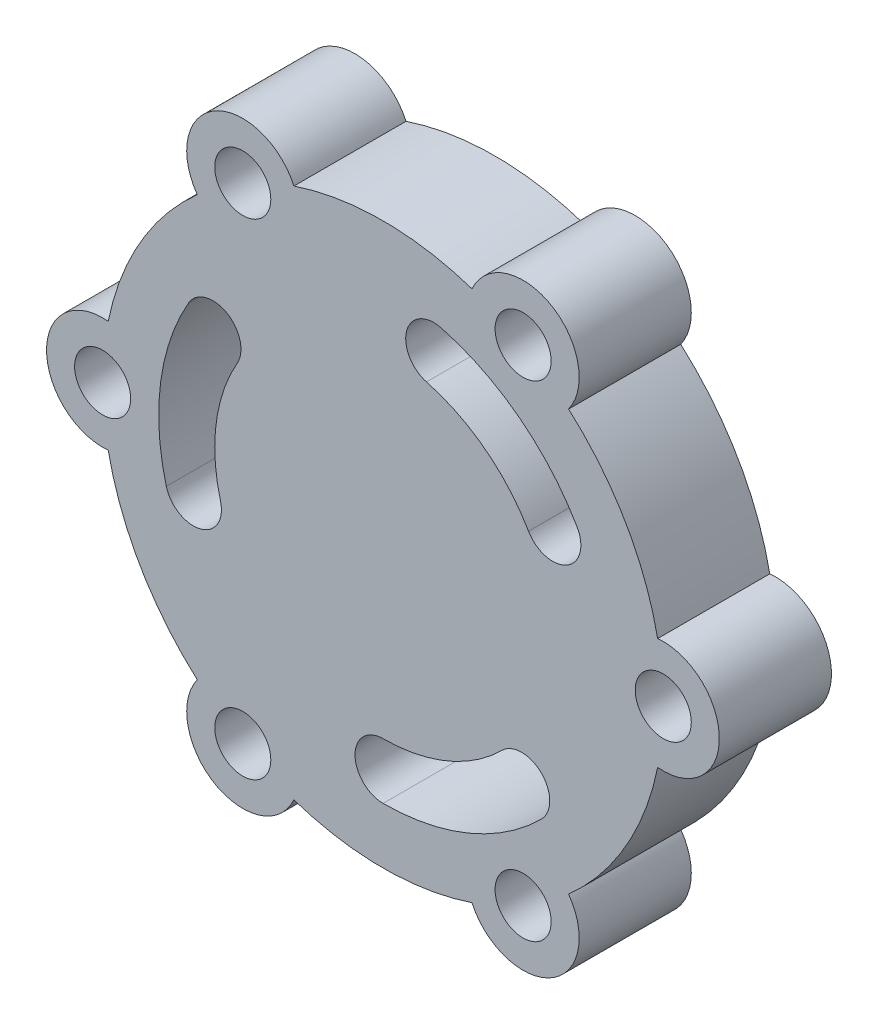
ISO-10303-21;
HEADER;
FILE_DESCRIPTION(('STEP AP214'),'2;1');
FILE_NAME('part.step','',(''),(''),'','','');
FILE_SCHEMA(('AUTOMOTIVE_DESIGN { 1 0 10303 214 1 1 1 1 }'));
ENDSEC;
DATA;
#1=APPLICATION_CONTEXT('core data for automotive mechanical design processes');
#2=APPLICATION_PROTOCOL_DEFINITION('international standard','automotive_design',2000,#1);
#3=PRODUCT_CONTEXT('',#1,'mechanical');
#4=PRODUCT('Part','Part','',(#3));
#5=PRODUCT_RELATED_PRODUCT_CATEGORY('part','',(#4));
#6=PRODUCT_DEFINITION_FORMATION('','',#4);
#7=PRODUCT_DEFINITION_CONTEXT('part definition',#1,'design');
#8=PRODUCT_DEFINITION('design','',#6,#7);
#9=PRODUCT_DEFINITION_SHAPE('','',#8);
#10=(LENGTH_UNIT() NAMED_UNIT(*) SI_UNIT(.MILLI.,.METRE.));
#11=(NAMED_UNIT(*) PLANE_ANGLE_UNIT() SI_UNIT($,.RADIAN.));
#12=(NAMED_UNIT(*) SI_UNIT($,.STERADIAN.) SOLID_ANGLE_UNIT());
#13=UNCERTAINTY_MEASURE_WITH_UNIT(LENGTH_MEASURE(1.E-05),#10,'distance_accuracy_value','');
#14=(GEOMETRIC_REPRESENTATION_CONTEXT(3) GLOBAL_UNCERTAINTY_ASSIGNED_CONTEXT((#13)) GLOBAL_UNIT_ASSIGNED_CONTEXT((#10,
#11,#12)) REPRESENTATION_CONTEXT('',''));
#15=CARTESIAN_POINT('',(0.,0.,0.));
#16=DIRECTION('',(0.,0.,1.));
#17=DIRECTION('',(1.,0.,0.));
#18=AXIS2_PLACEMENT_3D('',#15,#16,#17);
#19=CARTESIAN_POINT('',(45.000000000004,70.0000000000002,20.));
#20=DIRECTION('',(0.,0.,1.));
#21=DIRECTION('',(1.,0.,0.));
#22=AXIS2_PLACEMENT_3D('',#19,#20,#21);
#23=PLANE('',#22);
#24=CARTESIAN_POINT('',(45.0000000000064,113.301270189219,20.));
#25=DIRECTION('',(0.,0.,1.));
#26=DIRECTION('',(1.,0.,0.));
#27=AXIS2_PLACEMENT_3D('',#24,#25,#26);
#28=CIRCLE('',#27,4.99999999999999);
#29=CARTESIAN_POINT('',(50.0000000000064,113.301270189219,20.));
#30=VERTEX_POINT('',#29);
#31=EDGE_CURVE('E305',#30,#30,#28,.T.);
#32=ORIENTED_EDGE('',*,*,#31,.F.);
#33=EDGE_LOOP('',(#32));
#34=FACE_BOUND('',#33,.T.);
#35=CARTESIAN_POINT('',(45.0000000000058,26.6987298107816,20.));
#36=DIRECTION('',(0.,0.,1.));
#37=DIRECTION('',(1.,0.,0.));
#38=AXIS2_PLACEMENT_3D('',#35,#36,#37);
#39=CIRCLE('',#38,5.);
#40=CARTESIAN_POINT('',(50.0000000000058,26.6987298107816,20.));
#41=VERTEX_POINT('',#40);
#42=EDGE_CURVE('E316',#41,#41,#39,.T.);
#43=ORIENTED_EDGE('',*,*,#42,.F.);
#44=EDGE_LOOP('',(#43));
#45=FACE_BOUND('',#44,.T.);
#46=CARTESIAN_POINT('',(120.,70.,20.));
#47=DIRECTION('',(0.,0.,1.));
#48=DIRECTION('',(1.,0.,0.));
#49=AXIS2_PLACEMENT_3D('',#46,#47,#48);
#50=CIRCLE('',#49,5.00000000000001);
#51=CARTESIAN_POINT('',(125.,70.,20.));
#52=VERTEX_POINT('',#51);
#53=EDGE_CURVE('E329',#52,#52,#50,.T.);
#54=ORIENTED_EDGE('',*,*,#53,.F.);
#55=EDGE_LOOP('',(#54));
#56=FACE_BOUND('',#55,.T.);
#57=CARTESIAN_POINT('',(70.,70.,20.));
#58=DIRECTION('',(0.,0.,1.));
#59=DIRECTION('',(1.,0.,0.));
#60=AXIS2_PLACEMENT_3D('',#57,#58,#59);
#61=CIRCLE('',#60,50.);
#62=CARTESIAN_POINT('',(36.8831560301955,107.460307599907,20.));
#63=VERTEX_POINT('',#62);
#64=CARTESIAN_POINT('',(21.0000000000002,79.9498743710673,20.));
#65=VERTEX_POINT('',#64);
#66=EDGE_CURVE('E333',#63,#65,#61,.T.);
#67=ORIENTED_EDGE('',*,*,#66,.T.);
#68=CARTESIAN_POINT('',(20.000000000008,70.0000000000003,20.));
#69=DIRECTION('',(0.,0.,1.));
#70=DIRECTION('',(1.,0.,0.));
#71=AXIS2_PLACEMENT_3D('',#68,#69,#70);
#72=CIRCLE('',#71,10.);
#73=CARTESIAN_POINT('',(21.0000000000001,60.0501256289334,20.));
#74=VERTEX_POINT('',#73);
#75=EDGE_CURVE('E340',#65,#74,#72,.T.);
#76=ORIENTED_EDGE('',*,*,#75,.T.);
#77=CARTESIAN_POINT('',(70.,70.,20.));
#78=DIRECTION('',(0.,0.,1.));
#79=DIRECTION('',(1.,0.,0.));
#80=AXIS2_PLACEMENT_3D('',#77,#78,#79);
#81=CIRCLE('',#80,50.);
#82=CARTESIAN_POINT('',(36.8831560301949,32.5396924000939,20.));
#83=VERTEX_POINT('',#82);
#84=EDGE_CURVE('E338',#74,#83,#81,.T.);
#85=ORIENTED_EDGE('',*,*,#84,.T.);
#86=CARTESIAN_POINT('',(45.0000000000058,26.6987298107816,20.));
#87=DIRECTION('',(0.,0.,1.));
#88=DIRECTION('',(1.,0.,0.));
#89=AXIS2_PLACEMENT_3D('',#86,#87,#88);
#90=CIRCLE('',#89,10.);
#91=CARTESIAN_POINT('',(54.1168439698107,22.5898180290282,20.));
#92=VERTEX_POINT('',#91);
#93=EDGE_CURVE('E342',#83,#92,#90,.T.);
#94=ORIENTED_EDGE('',*,*,#93,.T.);
#95=CARTESIAN_POINT('',(70.,70.,20.));
#96=DIRECTION('',(0.,0.,1.));
#97=DIRECTION('',(1.,0.,0.));
#98=AXIS2_PLACEMENT_3D('',#95,#96,#97);
#99=CIRCLE('',#98,50.);
#100=CARTESIAN_POINT('',(85.8831560301959,22.5898180290304,20.));
#101=VERTEX_POINT('',#100);
#102=EDGE_CURVE('E343',#92,#101,#99,.T.);
#103=ORIENTED_EDGE('',*,*,#102,.T.);
#104=CARTESIAN_POINT('',(95.0000000000019,26.6987298107814,20.));
#105=DIRECTION('',(0.,0.,1.));
#106=DIRECTION('',(1.,0.,0.));
#107=AXIS2_PLACEMENT_3D('',#104,#105,#106);
#108=CIRCLE('',#107,9.99999999999999);
#109=CARTESIAN_POINT('',(103.11684396981,32.5396924000979,20.));
#110=VERTEX_POINT('',#109);
#111=EDGE_CURVE('E348',#101,#110,#108,.T.);
#112=ORIENTED_EDGE('',*,*,#111,.T.);
#113=CARTESIAN_POINT('',(70.,70.,20.));
#114=DIRECTION('',(0.,0.,1.));
#115=DIRECTION('',(1.,0.,0.));
#116=AXIS2_PLACEMENT_3D('',#113,#114,#115);
#117=CIRCLE('',#116,50.);
#118=CARTESIAN_POINT('',(119.,60.0501256289338,20.));
#119=VERTEX_POINT('',#118);
#120=EDGE_CURVE('E346',#110,#119,#117,.T.);
#121=ORIENTED_EDGE('',*,*,#120,.T.);
#122=CARTESIAN_POINT('',(120.,70.,20.));
#123=DIRECTION('',(0.,0.,1.));
#124=DIRECTION('',(1.,0.,0.));
#125=AXIS2_PLACEMENT_3D('',#122,#123,#124);
#126=CIRCLE('',#125,10.);
#127=CARTESIAN_POINT('',(119.,79.9498743710662,20.));
#128=VERTEX_POINT('',#127);
#129=EDGE_CURVE('E349',#119,#128,#126,.T.);
#130=ORIENTED_EDGE('',*,*,#129,.T.);
#131=CARTESIAN_POINT('',(70.,70.,20.));
#132=DIRECTION('',(0.,0.,1.));
#133=DIRECTION('',(1.,0.,0.));
#134=AXIS2_PLACEMENT_3D('',#131,#132,#133);
#135=CIRCLE('',#134,50.);
#136=CARTESIAN_POINT('',(103.11684396981,107.460307599902,20.));
#137=VERTEX_POINT('',#136);
#138=EDGE_CURVE('E355',#128,#137,#135,.T.);
#139=ORIENTED_EDGE('',*,*,#138,.T.);
#140=CARTESIAN_POINT('',(95.0000000000025,113.301270189218,20.));
#141=DIRECTION('',(0.,0.,1.));
#142=DIRECTION('',(1.,0.,0.));
#143=AXIS2_PLACEMENT_3D('',#140,#141,#142);
#144=CIRCLE('',#143,10.);
#145=CARTESIAN_POINT('',(85.8831560301966,117.410181970969,20.));
#146=VERTEX_POINT('',#145);
#147=EDGE_CURVE('E354',#137,#146,#144,.T.);
#148=ORIENTED_EDGE('',*,*,#147,.T.);
#149=CARTESIAN_POINT('',(70.,70.,20.));
#150=DIRECTION('',(0.,0.,1.));
#151=DIRECTION('',(1.,0.,0.));
#152=AXIS2_PLACEMENT_3D('',#149,#150,#151);
#153=CIRCLE('',#152,50.);
#154=CARTESIAN_POINT('',(54.1168439698113,117.410181970972,20.));
#155=VERTEX_POINT('',#154);
#156=EDGE_CURVE('E356',#146,#155,#153,.T.);
#157=ORIENTED_EDGE('',*,*,#156,.T.);
#158=CARTESIAN_POINT('',(45.0000000000064,113.301270189219,20.));
#159=DIRECTION('',(0.,0.,1.));
#160=DIRECTION('',(1.,0.,0.));
#161=AXIS2_PLACEMENT_3D('',#158,#159,#160);
#162=CIRCLE('',#161,9.99999999999999);
#163=EDGE_CURVE('E358',#155,#63,#162,.T.);
#164=ORIENTED_EDGE('',*,*,#163,.T.);
#165=EDGE_LOOP('',(#67,#76,#85,#94,#103,#112,#121,#130,#139,#148,#157,#164));
#166=FACE_BOUND('',#165,.T.);
#167=CARTESIAN_POINT('',(95.0000000000019,26.6987298107814,20.));
#168=DIRECTION('',(0.,0.,1.));
#169=DIRECTION('',(1.,0.,0.));
#170=AXIS2_PLACEMENT_3D('',#167,#168,#169);
#171=CIRCLE('',#170,5.);
#172=CARTESIAN_POINT('',(100.000000000002,26.6987298107814,20.));
#173=VERTEX_POINT('',#172);
#174=EDGE_CURVE('E325',#173,#173,#171,.T.);
#175=ORIENTED_EDGE('',*,*,#174,.F.);
#176=EDGE_LOOP('',(#175));
#177=FACE_BOUND('',#176,.T.);
#178=CARTESIAN_POINT('',(20.000000000008,70.0000000000003,20.));
#179=DIRECTION('',(0.,0.,1.));
#180=DIRECTION('',(1.,0.,0.));
#181=AXIS2_PLACEMENT_3D('',#178,#179,#180);
#182=CIRCLE('',#181,5.00000000000001);
#183=CARTESIAN_POINT('',(25.000000000008,70.0000000000003,20.));
#184=VERTEX_POINT('',#183);
#185=EDGE_CURVE('E307',#184,#184,#182,.T.);
#186=ORIENTED_EDGE('',*,*,#185,.F.);
#187=EDGE_LOOP('',(#186));
#188=FACE_BOUND('',#187,.T.);
#189=CARTESIAN_POINT('',(95.0000000000025,113.301270189218,20.));
#190=DIRECTION('',(0.,0.,1.));
#191=DIRECTION('',(1.,0.,0.));
#192=AXIS2_PLACEMENT_3D('',#189,#190,#191);
#193=CIRCLE('',#192,5.00000000000001);
#194=CARTESIAN_POINT('',(100.000000000003,113.301270189218,20.));
#195=VERTEX_POINT('',#194);
#196=EDGE_CURVE('E299',#195,#195,#193,.T.);
#197=ORIENTED_EDGE('',*,*,#196,.F.);
#198=EDGE_LOOP('',(#197));
#199=FACE_BOUND('',#198,.T.);
#200=CARTESIAN_POINT('',(70.,70.,20.));
#201=DIRECTION('',(0.,0.,1.));
#202=DIRECTION('',(1.,0.,0.));
#203=AXIS2_PLACEMENT_3D('',#200,#201,#202);
#204=CIRCLE('',#203,39.9999999999955);
#205=CARTESIAN_POINT('',(104.627429297882,90.0235146819895,20.));
#206=VERTEX_POINT('',#205);
#207=CARTESIAN_POINT('',(80.3527618040996,108.637033051558,20.));
#208=VERTEX_POINT('',#207);
#209=EDGE_CURVE('E267',#206,#208,#204,.T.);
#210=ORIENTED_EDGE('',*,*,#209,.F.);
#211=CARTESIAN_POINT('',(100.29900063565,87.520575346742,20.));
#212=DIRECTION('',(0.,0.,1.));
#213=DIRECTION('',(1.,0.,0.));
#214=AXIS2_PLACEMENT_3D('',#211,#212,#213);
#215=CIRCLE('',#214,4.99999999999544);
#216=CARTESIAN_POINT('',(95.9705719734181,85.0176360114962,20.));
#217=VERTEX_POINT('',#216);
#218=EDGE_CURVE('E270',#217,#206,#215,.T.);
#219=ORIENTED_EDGE('',*,*,#218,.F.);
#220=CARTESIAN_POINT('',(70.,70.,20.));
#221=DIRECTION('',(0.,0.,-1.));
#222=DIRECTION('',(1.,0.,0.));
#223=AXIS2_PLACEMENT_3D('',#220,#221,#222);
#224=CIRCLE('',#223,30.0000000000046);
#225=CARTESIAN_POINT('',(77.7645713530768,98.9777747886765,20.));
#226=VERTEX_POINT('',#225);
#227=EDGE_CURVE('E274',#226,#217,#224,.T.);
#228=ORIENTED_EDGE('',*,*,#227,.F.);
#229=CARTESIAN_POINT('',(79.0586665785882,103.807403920117,20.));
#230=DIRECTION('',(0.,0.,1.));
#231=DIRECTION('',(1.,0.,0.));
#232=AXIS2_PLACEMENT_3D('',#229,#230,#231);
#233=CIRCLE('',#232,4.99999999999544);
#234=EDGE_CURVE('E275',#208,#226,#233,.T.);
#235=ORIENTED_EDGE('',*,*,#234,.F.);
#236=EDGE_LOOP('',(#210,#219,#228,#235));
#237=FACE_BOUND('',#236,.T.);
#238=CARTESIAN_POINT('',(94.7487373415292,45.2512626584709,20.));
#239=DIRECTION('',(0.,0.,1.));
#240=DIRECTION('',(1.,0.,0.));
#241=AXIS2_PLACEMENT_3D('',#238,#239,#240);
#242=CIRCLE('',#241,4.99999999999543);
#243=CARTESIAN_POINT('',(98.2842712474587,41.7157287525414,20.));
#244=VERTEX_POINT('',#243);
#245=CARTESIAN_POINT('',(91.2132034355997,48.7867965644003,20.));
#246=VERTEX_POINT('',#245);
#247=EDGE_CURVE('E239',#244,#246,#242,.T.);
#248=ORIENTED_EDGE('',*,*,#247,.F.);
#249=CARTESIAN_POINT('',(70.,70.,20.));
#250=DIRECTION('',(0.,0.,1.));
#251=DIRECTION('',(1.,0.,0.));
#252=AXIS2_PLACEMENT_3D('',#249,#250,#251);
#253=CIRCLE('',#252,39.9999999999955);
#254=CARTESIAN_POINT('',(70.0271577387128,30.0000092192903,20.));
#255=VERTEX_POINT('',#254);
#256=EDGE_CURVE('E237',#255,#244,#253,.T.);
#257=ORIENTED_EDGE('',*,*,#256,.F.);
#258=CARTESIAN_POINT('',(70.0237630213737,35.000008066875,20.));
#259=DIRECTION('',(0.,0.,1.));
#260=DIRECTION('',(1.,0.,0.));
#261=AXIS2_PLACEMENT_3D('',#258,#259,#260);
#262=CIRCLE('',#261,4.99999999999543);
#263=CARTESIAN_POINT('',(70.0203683040346,40.0000069144597,20.));
#264=VERTEX_POINT('',#263);
#265=EDGE_CURVE('E243',#264,#255,#262,.T.);
#266=ORIENTED_EDGE('',*,*,#265,.F.);
#267=CARTESIAN_POINT('',(70.,70.,20.));
#268=DIRECTION('',(0.,0.,-1.));
#269=DIRECTION('',(1.,0.,0.));
#270=AXIS2_PLACEMENT_3D('',#267,#268,#269);
#271=CIRCLE('',#270,30.0000000000046);
#272=EDGE_CURVE('E241',#246,#264,#271,.T.);
#273=ORIENTED_EDGE('',*,*,#272,.F.);
#274=EDGE_LOOP('',(#248,#257,#266,#273));
#275=FACE_BOUND('',#274,.T.);
#276=CARTESIAN_POINT('',(36.1925960798826,60.9413334214117,20.));
#277=DIRECTION('',(0.,0.,1.));
#278=DIRECTION('',(1.,0.,0.));
#279=AXIS2_PLACEMENT_3D('',#276,#277,#278);
#280=CIRCLE('',#279,4.99999999999544);
#281=CARTESIAN_POINT('',(31.3629669484417,59.6472381959003,20.));
#282=VERTEX_POINT('',#281);
#283=CARTESIAN_POINT('',(41.0222252113235,62.2354286469232,20.));
#284=VERTEX_POINT('',#283);
#285=EDGE_CURVE('E209',#282,#284,#280,.T.);
#286=ORIENTED_EDGE('',*,*,#285,.F.);
#287=CARTESIAN_POINT('',(70.,70.,20.));
#288=DIRECTION('',(0.,0.,1.));
#289=DIRECTION('',(1.,0.,0.));
#290=AXIS2_PLACEMENT_3D('',#287,#288,#289);
#291=CIRCLE('',#290,39.9999999999948);
#292=CARTESIAN_POINT('',(35.3454129634063,89.9764760987201,20.));
#293=VERTEX_POINT('',#292);
#294=EDGE_CURVE('E200',#293,#282,#291,.T.);
#295=ORIENTED_EDGE('',*,*,#294,.F.);
#296=CARTESIAN_POINT('',(39.6772363429764,87.4794165863822,20.));
#297=DIRECTION('',(0.,0.,1.));
#298=DIRECTION('',(1.,0.,0.));
#299=AXIS2_PLACEMENT_3D('',#296,#297,#298);
#300=CIRCLE('',#299,4.99999999999477);
#301=CARTESIAN_POINT('',(44.0090597225467,84.9823570740445,20.));
#302=VERTEX_POINT('',#301);
#303=EDGE_CURVE('E225',#302,#293,#300,.T.);
#304=ORIENTED_EDGE('',*,*,#303,.F.);
#305=CARTESIAN_POINT('',(70.,70.,20.));
#306=DIRECTION('',(0.,0.,-1.));
#307=DIRECTION('',(1.,0.,0.));
#308=AXIS2_PLACEMENT_3D('',#305,#306,#307);
#309=CIRCLE('',#308,30.0000000000046);
#310=EDGE_CURVE('E217',#284,#302,#309,.T.);
#311=ORIENTED_EDGE('',*,*,#310,.F.);
#312=EDGE_LOOP('',(#286,#295,#304,#311));
#313=FACE_BOUND('',#312,.T.);
#314=ADVANCED_FACE('F39',(#34,#45,#56,#166,#177,#188,#199,#237,#275,#313),#23,.T.);
#315=CARTESIAN_POINT('',(45.000000000004,70.0000000000002,0.));
#316=DIRECTION('',(0.,0.,1.));
#317=DIRECTION('',(1.,0.,0.));
#318=AXIS2_PLACEMENT_3D('',#315,#316,#317);
#319=PLANE('',#318);
#320=CARTESIAN_POINT('',(70.,70.,0.));
#321=DIRECTION('',(0.,0.,1.));
#322=DIRECTION('',(1.,0.,0.));
#323=AXIS2_PLACEMENT_3D('',#320,#321,#322);
#324=CIRCLE('',#323,39.9999999999955);
#325=CARTESIAN_POINT('',(70.0271577387128,30.0000092192903,0.));
#326=VERTEX_POINT('',#325);
#327=CARTESIAN_POINT('',(98.2842712474587,41.7157287525414,0.));
#328=VERTEX_POINT('',#327);
#329=EDGE_CURVE('E218',#326,#328,#324,.T.);
#330=ORIENTED_EDGE('',*,*,#329,.T.);
#331=CARTESIAN_POINT('',(94.7487373415292,45.2512626584709,0.));
#332=DIRECTION('',(0.,0.,1.));
#333=DIRECTION('',(1.,0.,0.));
#334=AXIS2_PLACEMENT_3D('',#331,#332,#333);
#335=CIRCLE('',#334,4.99999999999543);
#336=CARTESIAN_POINT('',(91.2132034355997,48.7867965644003,0.));
#337=VERTEX_POINT('',#336);
#338=EDGE_CURVE('E249',#328,#337,#335,.T.);
#339=ORIENTED_EDGE('',*,*,#338,.T.);
#340=CARTESIAN_POINT('',(70.,70.,0.));
#341=DIRECTION('',(0.,0.,-1.));
#342=DIRECTION('',(1.,0.,0.));
#343=AXIS2_PLACEMENT_3D('',#340,#341,#342);
#344=CIRCLE('',#343,30.0000000000046);
#345=CARTESIAN_POINT('',(70.0203683040346,40.0000069144597,0.));
#346=VERTEX_POINT('',#345);
#347=EDGE_CURVE('E252',#337,#346,#344,.T.);
#348=ORIENTED_EDGE('',*,*,#347,.T.);
#349=CARTESIAN_POINT('',(70.0237630213737,35.000008066875,0.));
#350=DIRECTION('',(0.,0.,1.));
#351=DIRECTION('',(1.,0.,0.));
#352=AXIS2_PLACEMENT_3D('',#349,#350,#351);
#353=CIRCLE('',#352,4.99999999999543);
#354=EDGE_CURVE('E236',#346,#326,#353,.T.);
#355=ORIENTED_EDGE('',*,*,#354,.T.);
#356=EDGE_LOOP('',(#330,#339,#348,#355));
#357=FACE_BOUND('',#356,.T.);
#358=CARTESIAN_POINT('',(95.0000000000025,113.301270189218,0.));
#359=DIRECTION('',(0.,0.,1.));
#360=DIRECTION('',(1.,0.,0.));
#361=AXIS2_PLACEMENT_3D('',#358,#359,#360);
#362=CIRCLE('',#361,5.00000000000001);
#363=CARTESIAN_POINT('',(100.000000000003,113.301270189218,0.));
#364=VERTEX_POINT('',#363);
#365=EDGE_CURVE('E297',#364,#364,#362,.T.);
#366=ORIENTED_EDGE('',*,*,#365,.T.);
#367=EDGE_LOOP('',(#366));
#368=FACE_BOUND('',#367,.T.);
#369=CARTESIAN_POINT('',(45.0000000000064,113.301270189219,0.));
#370=DIRECTION('',(0.,0.,1.));
#371=DIRECTION('',(1.,0.,0.));
#372=AXIS2_PLACEMENT_3D('',#369,#370,#371);
#373=CIRCLE('',#372,4.99999999999999);
#374=CARTESIAN_POINT('',(50.0000000000064,113.301270189219,0.));
#375=VERTEX_POINT('',#374);
#376=EDGE_CURVE('E303',#375,#375,#373,.T.);
#377=ORIENTED_EDGE('',*,*,#376,.T.);
#378=EDGE_LOOP('',(#377));
#379=FACE_BOUND('',#378,.T.);
#380=CARTESIAN_POINT('',(20.000000000008,70.0000000000003,0.));
#381=DIRECTION('',(0.,0.,1.));
#382=DIRECTION('',(1.,0.,0.));
#383=AXIS2_PLACEMENT_3D('',#380,#381,#382);
#384=CIRCLE('',#383,5.00000000000001);
#385=CARTESIAN_POINT('',(25.000000000008,70.0000000000003,0.));
#386=VERTEX_POINT('',#385);
#387=EDGE_CURVE('E310',#386,#386,#384,.T.);
#388=ORIENTED_EDGE('',*,*,#387,.T.);
#389=EDGE_LOOP('',(#388));
#390=FACE_BOUND('',#389,.T.);
#391=CARTESIAN_POINT('',(45.0000000000058,26.6987298107816,0.));
#392=DIRECTION('',(0.,0.,1.));
#393=DIRECTION('',(1.,0.,0.));
#394=AXIS2_PLACEMENT_3D('',#391,#392,#393);
#395=CIRCLE('',#394,5.);
#396=CARTESIAN_POINT('',(50.0000000000058,26.6987298107816,0.));
#397=VERTEX_POINT('',#396);
#398=EDGE_CURVE('E313',#397,#397,#395,.T.);
#399=ORIENTED_EDGE('',*,*,#398,.T.);
#400=EDGE_LOOP('',(#399));
#401=FACE_BOUND('',#400,.T.);
#402=CARTESIAN_POINT('',(95.0000000000019,26.6987298107814,0.));
#403=DIRECTION('',(0.,0.,1.));
#404=DIRECTION('',(1.,0.,0.));
#405=AXIS2_PLACEMENT_3D('',#402,#403,#404);
#406=CIRCLE('',#405,5.);
#407=CARTESIAN_POINT('',(100.000000000002,26.6987298107814,0.));
#408=VERTEX_POINT('',#407);
#409=EDGE_CURVE('E317',#408,#408,#406,.T.);
#410=ORIENTED_EDGE('',*,*,#409,.T.);
#411=EDGE_LOOP('',(#410));
#412=FACE_BOUND('',#411,.T.);
#413=CARTESIAN_POINT('',(120.,70.,0.));
#414=DIRECTION('',(0.,0.,1.));
#415=DIRECTION('',(1.,0.,0.));
#416=AXIS2_PLACEMENT_3D('',#413,#414,#415);
#417=CIRCLE('',#416,5.00000000000001);
#418=CARTESIAN_POINT('',(125.,70.,0.));
#419=VERTEX_POINT('',#418);
#420=EDGE_CURVE('E324',#419,#419,#417,.T.);
#421=ORIENTED_EDGE('',*,*,#420,.T.);
#422=EDGE_LOOP('',(#421));
#423=FACE_BOUND('',#422,.T.);
#424=CARTESIAN_POINT('',(70.,70.,0.));
#425=DIRECTION('',(0.,0.,1.));
#426=DIRECTION('',(1.,0.,0.));
#427=AXIS2_PLACEMENT_3D('',#424,#425,#426);
#428=CIRCLE('',#427,50.);
#429=CARTESIAN_POINT('',(36.8831560301955,107.460307599907,0.));
#430=VERTEX_POINT('',#429);
#431=CARTESIAN_POINT('',(21.0000000000002,79.9498743710673,0.));
#432=VERTEX_POINT('',#431);
#433=EDGE_CURVE('E331',#430,#432,#428,.T.);
#434=ORIENTED_EDGE('',*,*,#433,.F.);
#435=CARTESIAN_POINT('',(45.0000000000064,113.301270189219,0.));
#436=DIRECTION('',(0.,0.,1.));
#437=DIRECTION('',(1.,0.,0.));
#438=AXIS2_PLACEMENT_3D('',#435,#436,#437);
#439=CIRCLE('',#438,9.99999999999999);
#440=CARTESIAN_POINT('',(54.1168439698113,117.410181970972,0.));
#441=VERTEX_POINT('',#440);
#442=EDGE_CURVE('E336',#441,#430,#439,.T.);
#443=ORIENTED_EDGE('',*,*,#442,.F.);
#444=CARTESIAN_POINT('',(70.,70.,0.));
#445=DIRECTION('',(0.,0.,1.));
#446=DIRECTION('',(1.,0.,0.));
#447=AXIS2_PLACEMENT_3D('',#444,#445,#446);
#448=CIRCLE('',#447,50.);
#449=CARTESIAN_POINT('',(85.8831560301966,117.410181970969,0.));
#450=VERTEX_POINT('',#449);
#451=EDGE_CURVE('E382',#450,#441,#448,.T.);
#452=ORIENTED_EDGE('',*,*,#451,.F.);
#453=CARTESIAN_POINT('',(95.0000000000025,113.301270189218,0.));
#454=DIRECTION('',(0.,0.,1.));
#455=DIRECTION('',(1.,0.,0.));
#456=AXIS2_PLACEMENT_3D('',#453,#454,#455);
#457=CIRCLE('',#456,10.);
#458=CARTESIAN_POINT('',(103.11684396981,107.460307599902,0.));
#459=VERTEX_POINT('',#458);
#460=EDGE_CURVE('E378',#459,#450,#457,.T.);
#461=ORIENTED_EDGE('',*,*,#460,.F.);
#462=CARTESIAN_POINT('',(70.,70.,0.));
#463=DIRECTION('',(0.,0.,1.));
#464=DIRECTION('',(1.,0.,0.));
#465=AXIS2_PLACEMENT_3D('',#462,#463,#464);
#466=CIRCLE('',#465,50.);
#467=CARTESIAN_POINT('',(119.,79.9498743710662,0.));
#468=VERTEX_POINT('',#467);
#469=EDGE_CURVE('E377',#468,#459,#466,.T.);
#470=ORIENTED_EDGE('',*,*,#469,.F.);
#471=CARTESIAN_POINT('',(120.,70.,0.));
#472=DIRECTION('',(0.,0.,1.));
#473=DIRECTION('',(1.,0.,0.));
#474=AXIS2_PLACEMENT_3D('',#471,#472,#473);
#475=CIRCLE('',#474,10.);
#476=CARTESIAN_POINT('',(119.,60.0501256289338,0.));
#477=VERTEX_POINT('',#476);
#478=EDGE_CURVE('E373',#477,#468,#475,.T.);
#479=ORIENTED_EDGE('',*,*,#478,.F.);
#480=CARTESIAN_POINT('',(70.,70.,0.));
#481=DIRECTION('',(0.,0.,1.));
#482=DIRECTION('',(1.,0.,0.));
#483=AXIS2_PLACEMENT_3D('',#480,#481,#482);
#484=CIRCLE('',#483,50.);
#485=CARTESIAN_POINT('',(103.11684396981,32.5396924000979,0.));
#486=VERTEX_POINT('',#485);
#487=EDGE_CURVE('E374',#486,#477,#484,.T.);
#488=ORIENTED_EDGE('',*,*,#487,.F.);
#489=CARTESIAN_POINT('',(95.0000000000019,26.6987298107814,0.));
#490=DIRECTION('',(0.,0.,1.));
#491=DIRECTION('',(1.,0.,0.));
#492=AXIS2_PLACEMENT_3D('',#489,#490,#491);
#493=CIRCLE('',#492,9.99999999999999);
#494=CARTESIAN_POINT('',(85.8831560301959,22.5898180290304,0.));
#495=VERTEX_POINT('',#494);
#496=EDGE_CURVE('E372',#495,#486,#493,.T.);
#497=ORIENTED_EDGE('',*,*,#496,.F.);
#498=CARTESIAN_POINT('',(70.,70.,0.));
#499=DIRECTION('',(0.,0.,1.));
#500=DIRECTION('',(1.,0.,0.));
#501=AXIS2_PLACEMENT_3D('',#498,#499,#500);
#502=CIRCLE('',#501,50.);
#503=CARTESIAN_POINT('',(54.1168439698107,22.5898180290282,0.));
#504=VERTEX_POINT('',#503);
#505=EDGE_CURVE('E368',#504,#495,#502,.T.);
#506=ORIENTED_EDGE('',*,*,#505,.F.);
#507=CARTESIAN_POINT('',(45.0000000000058,26.6987298107816,0.));
#508=DIRECTION('',(0.,0.,1.));
#509=DIRECTION('',(1.,0.,0.));
#510=AXIS2_PLACEMENT_3D('',#507,#508,#509);
#511=CIRCLE('',#510,10.);
#512=CARTESIAN_POINT('',(36.8831560301949,32.5396924000939,0.));
#513=VERTEX_POINT('',#512);
#514=EDGE_CURVE('E370',#513,#504,#511,.T.);
#515=ORIENTED_EDGE('',*,*,#514,.F.);
#516=CARTESIAN_POINT('',(70.,70.,0.));
#517=DIRECTION('',(0.,0.,1.));
#518=DIRECTION('',(1.,0.,0.));
#519=AXIS2_PLACEMENT_3D('',#516,#517,#518);
#520=CIRCLE('',#519,50.);
#521=CARTESIAN_POINT('',(21.0000000000001,60.0501256289334,0.));
#522=VERTEX_POINT('',#521);
#523=EDGE_CURVE('E364',#522,#513,#520,.T.);
#524=ORIENTED_EDGE('',*,*,#523,.F.);
#525=CARTESIAN_POINT('',(20.000000000008,70.0000000000003,0.));
#526=DIRECTION('',(0.,0.,1.));
#527=DIRECTION('',(1.,0.,0.));
#528=AXIS2_PLACEMENT_3D('',#525,#526,#527);
#529=CIRCLE('',#528,10.);
#530=EDGE_CURVE('E363',#432,#522,#529,.T.);
#531=ORIENTED_EDGE('',*,*,#530,.F.);
#532=EDGE_LOOP('',(#434,#443,#452,#461,#470,#479,#488,#497,#506,#515,#524,#531));
#533=FACE_BOUND('',#532,.T.);
#534=CARTESIAN_POINT('',(100.29900063565,87.520575346742,0.));
#535=DIRECTION('',(0.,0.,1.));
#536=DIRECTION('',(1.,0.,0.));
#537=AXIS2_PLACEMENT_3D('',#534,#535,#536);
#538=CIRCLE('',#537,4.99999999999544);
#539=CARTESIAN_POINT('',(95.9705719734181,85.0176360114962,0.));
#540=VERTEX_POINT('',#539);
#541=CARTESIAN_POINT('',(104.627429297882,90.0235146819895,0.));
#542=VERTEX_POINT('',#541);
#543=EDGE_CURVE('E266',#540,#542,#538,.T.);
#544=ORIENTED_EDGE('',*,*,#543,.T.);
#545=CARTESIAN_POINT('',(70.,70.,0.));
#546=DIRECTION('',(0.,0.,1.));
#547=DIRECTION('',(1.,0.,0.));
#548=AXIS2_PLACEMENT_3D('',#545,#546,#547);
#549=CIRCLE('',#548,39.9999999999955);
#550=CARTESIAN_POINT('',(80.3527618040996,108.637033051558,0.));
#551=VERTEX_POINT('',#550);
#552=EDGE_CURVE('E279',#542,#551,#549,.T.);
#553=ORIENTED_EDGE('',*,*,#552,.T.);
#554=CARTESIAN_POINT('',(79.0586665785882,103.807403920117,0.));
#555=DIRECTION('',(0.,0.,1.));
#556=DIRECTION('',(1.,0.,0.));
#557=AXIS2_PLACEMENT_3D('',#554,#555,#556);
#558=CIRCLE('',#557,4.99999999999544);
#559=CARTESIAN_POINT('',(77.7645713530768,98.9777747886765,0.));
#560=VERTEX_POINT('',#559);
#561=EDGE_CURVE('E284',#551,#560,#558,.T.);
#562=ORIENTED_EDGE('',*,*,#561,.T.);
#563=CARTESIAN_POINT('',(70.,70.,0.));
#564=DIRECTION('',(0.,0.,-1.));
#565=DIRECTION('',(1.,0.,0.));
#566=AXIS2_PLACEMENT_3D('',#563,#564,#565);
#567=CIRCLE('',#566,30.0000000000046);
#568=EDGE_CURVE('E269',#560,#540,#567,.T.);
#569=ORIENTED_EDGE('',*,*,#568,.T.);
#570=EDGE_LOOP('',(#544,#553,#562,#569));
#571=FACE_BOUND('',#570,.T.);
#572=CARTESIAN_POINT('',(70.,70.,0.));
#573=DIRECTION('',(0.,0.,1.));
#574=DIRECTION('',(1.,0.,0.));
#575=AXIS2_PLACEMENT_3D('',#572,#573,#574);
#576=CIRCLE('',#575,39.9999999999948);
#577=CARTESIAN_POINT('',(35.3454129634063,89.9764760987201,0.));
#578=VERTEX_POINT('',#577);
#579=CARTESIAN_POINT('',(31.3629669484417,59.6472381959003,0.));
#580=VERTEX_POINT('',#579);
#581=EDGE_CURVE('E62',#578,#580,#576,.T.);
#582=ORIENTED_EDGE('',*,*,#581,.T.);
#583=CARTESIAN_POINT('',(36.1925960798826,60.9413334214117,0.));
#584=DIRECTION('',(0.,0.,1.));
#585=DIRECTION('',(1.,0.,0.));
#586=AXIS2_PLACEMENT_3D('',#583,#584,#585);
#587=CIRCLE('',#586,4.99999999999544);
#588=CARTESIAN_POINT('',(41.0222252113235,62.2354286469232,0.));
#589=VERTEX_POINT('',#588);
#590=EDGE_CURVE('E214',#580,#589,#587,.T.);
#591=ORIENTED_EDGE('',*,*,#590,.T.);
#592=CARTESIAN_POINT('',(70.,70.,0.));
#593=DIRECTION('',(0.,0.,-1.));
#594=DIRECTION('',(1.,0.,0.));
#595=AXIS2_PLACEMENT_3D('',#592,#593,#594);
#596=CIRCLE('',#595,30.0000000000046);
#597=CARTESIAN_POINT('',(44.0090597225467,84.9823570740445,0.));
#598=VERTEX_POINT('',#597);
#599=EDGE_CURVE('E228',#589,#598,#596,.T.);
#600=ORIENTED_EDGE('',*,*,#599,.T.);
#601=CARTESIAN_POINT('',(39.6772363429764,87.4794165863822,0.));
#602=DIRECTION('',(0.,0.,1.));
#603=DIRECTION('',(1.,0.,0.));
#604=AXIS2_PLACEMENT_3D('',#601,#602,#603);
#605=CIRCLE('',#604,4.99999999999477);
#606=EDGE_CURVE('E208',#598,#578,#605,.T.);
#607=ORIENTED_EDGE('',*,*,#606,.T.);
#608=EDGE_LOOP('',(#582,#591,#600,#607));
#609=FACE_BOUND('',#608,.T.);
#610=ADVANCED_FACE('F424',(#357,#368,#379,#390,#401,#412,#423,#533,#571,#609),#319,.F.);
#611=CARTESIAN_POINT('',(70.,70.,20.));
#612=DIRECTION('',(0.,0.,-1.));
#613=DIRECTION('',(-1.,0.,0.));
#614=AXIS2_PLACEMENT_3D('',#611,#612,#613);
#615=CYLINDRICAL_SURFACE('',#614,50.);
#616=ORIENTED_EDGE('',*,*,#433,.T.);
#617=DIRECTION('',(0.,0.,-1.));
#618=VECTOR('',#617,1.);
#619=CARTESIAN_POINT('',(21.0000000000002,79.9498743710673,20.));
#620=LINE('',#619,#618);
#621=EDGE_CURVE('E11',#65,#432,#620,.T.);
#622=ORIENTED_EDGE('',*,*,#621,.F.);
#623=ORIENTED_EDGE('',*,*,#66,.F.);
#624=DIRECTION('',(0.,0.,-1.));
#625=VECTOR('',#624,1.);
#626=CARTESIAN_POINT('',(36.8831560301955,107.460307599907,20.));
#627=LINE('',#626,#625);
#628=EDGE_CURVE('E359',#63,#430,#627,.T.);
#629=ORIENTED_EDGE('',*,*,#628,.T.);
#630=EDGE_LOOP('',(#616,#622,#623,#629));
#631=FACE_BOUND('',#630,.T.);
#632=ADVANCED_FACE('F41',(#631),#615,.T.);
#633=CARTESIAN_POINT('',(20.000000000008,70.0000000000003,20.));
#634=DIRECTION('',(0.,0.,-1.));
#635=DIRECTION('',(-1.,0.,0.));
#636=AXIS2_PLACEMENT_3D('',#633,#634,#635);
#637=CYLINDRICAL_SURFACE('',#636,10.);
#638=ORIENTED_EDGE('',*,*,#530,.T.);
#639=DIRECTION('',(0.,0.,-1.));
#640=VECTOR('',#639,1.);
#641=CARTESIAN_POINT('',(21.0000000000001,60.0501256289334,20.));
#642=LINE('',#641,#640);
#643=EDGE_CURVE('E50',#74,#522,#642,.T.);
#644=ORIENTED_EDGE('',*,*,#643,.F.);
#645=ORIENTED_EDGE('',*,*,#75,.F.);
#646=ORIENTED_EDGE('',*,*,#621,.T.);
#647=EDGE_LOOP('',(#638,#644,#645,#646));
#648=FACE_BOUND('',#647,.T.);
#649=ADVANCED_FACE('F443',(#648),#637,.T.);
#650=CARTESIAN_POINT('',(70.,70.,20.));
#651=DIRECTION('',(0.,0.,-1.));
#652=DIRECTION('',(-1.,0.,0.));
#653=AXIS2_PLACEMENT_3D('',#650,#651,#652);
#654=CYLINDRICAL_SURFACE('',#653,50.);
#655=ORIENTED_EDGE('',*,*,#523,.T.);
#656=DIRECTION('',(0.,0.,-1.));
#657=VECTOR('',#656,1.);
#658=CARTESIAN_POINT('',(36.8831560301949,32.5396924000939,20.));
#659=LINE('',#658,#657);
#660=EDGE_CURVE('E409',#83,#513,#659,.T.);
#661=ORIENTED_EDGE('',*,*,#660,.F.);
#662=ORIENTED_EDGE('',*,*,#84,.F.);
#663=ORIENTED_EDGE('',*,*,#643,.T.);
#664=EDGE_LOOP('',(#655,#661,#662,#663));
#665=FACE_BOUND('',#664,.T.);
#666=ADVANCED_FACE('F420',(#665),#654,.T.);
#667=CARTESIAN_POINT('',(45.0000000000058,26.6987298107816,20.));
#668=DIRECTION('',(0.,0.,-1.));
#669=DIRECTION('',(-1.,0.,0.));
#670=AXIS2_PLACEMENT_3D('',#667,#668,#669);
#671=CYLINDRICAL_SURFACE('',#670,10.);
#672=ORIENTED_EDGE('',*,*,#514,.T.);
#673=DIRECTION('',(0.,0.,-1.));
#674=VECTOR('',#673,1.);
#675=CARTESIAN_POINT('',(54.1168439698107,22.5898180290282,20.));
#676=LINE('',#675,#674);
#677=EDGE_CURVE('E410',#92,#504,#676,.T.);
#678=ORIENTED_EDGE('',*,*,#677,.F.);
#679=ORIENTED_EDGE('',*,*,#93,.F.);
#680=ORIENTED_EDGE('',*,*,#660,.T.);
#681=EDGE_LOOP('',(#672,#678,#679,#680));
#682=FACE_BOUND('',#681,.T.);
#683=ADVANCED_FACE('F429',(#682),#671,.T.);
#684=CARTESIAN_POINT('',(70.,70.,20.));
#685=DIRECTION('',(0.,0.,-1.));
#686=DIRECTION('',(-1.,0.,0.));
#687=AXIS2_PLACEMENT_3D('',#684,#685,#686);
#688=CYLINDRICAL_SURFACE('',#687,50.);
#689=ORIENTED_EDGE('',*,*,#505,.T.);
#690=DIRECTION('',(0.,0.,-1.));
#691=VECTOR('',#690,1.);
#692=CARTESIAN_POINT('',(85.8831560301959,22.5898180290304,20.));
#693=LINE('',#692,#691);
#694=EDGE_CURVE('E402',#101,#495,#693,.T.);
#695=ORIENTED_EDGE('',*,*,#694,.F.);
#696=ORIENTED_EDGE('',*,*,#102,.F.);
#697=ORIENTED_EDGE('',*,*,#677,.T.);
#698=EDGE_LOOP('',(#689,#695,#696,#697));
#699=FACE_BOUND('',#698,.T.);
#700=ADVANCED_FACE('F434',(#699),#688,.T.);
#701=CARTESIAN_POINT('',(95.0000000000019,26.6987298107814,20.));
#702=DIRECTION('',(0.,0.,-1.));
#703=DIRECTION('',(-1.,0.,0.));
#704=AXIS2_PLACEMENT_3D('',#701,#702,#703);
#705=CYLINDRICAL_SURFACE('',#704,9.99999999999999);
#706=ORIENTED_EDGE('',*,*,#496,.T.);
#707=DIRECTION('',(0.,0.,-1.));
#708=VECTOR('',#707,1.);
#709=CARTESIAN_POINT('',(103.11684396981,32.5396924000979,20.));
#710=LINE('',#709,#708);
#711=EDGE_CURVE('E401',#110,#486,#710,.T.);
#712=ORIENTED_EDGE('',*,*,#711,.F.);
#713=ORIENTED_EDGE('',*,*,#111,.F.);
#714=ORIENTED_EDGE('',*,*,#694,.T.);
#715=EDGE_LOOP('',(#706,#712,#713,#714));
#716=FACE_BOUND('',#715,.T.);
#717=ADVANCED_FACE('F474',(#716),#705,.T.);
#718=CARTESIAN_POINT('',(70.,70.,20.));
#719=DIRECTION('',(0.,0.,-1.));
#720=DIRECTION('',(-1.,0.,0.));
#721=AXIS2_PLACEMENT_3D('',#718,#719,#720);
#722=CYLINDRICAL_SURFACE('',#721,50.);
#723=ORIENTED_EDGE('',*,*,#487,.T.);
#724=DIRECTION('',(0.,0.,-1.));
#725=VECTOR('',#724,1.);
#726=CARTESIAN_POINT('',(119.,60.0501256289338,20.));
#727=LINE('',#726,#725);
#728=EDGE_CURVE('E396',#119,#477,#727,.T.);
#729=ORIENTED_EDGE('',*,*,#728,.F.);
#730=ORIENTED_EDGE('',*,*,#120,.F.);
#731=ORIENTED_EDGE('',*,*,#711,.T.);
#732=EDGE_LOOP('',(#723,#729,#730,#731));
#733=FACE_BOUND('',#732,.T.);
#734=ADVANCED_FACE('F475',(#733),#722,.T.);
#735=CARTESIAN_POINT('',(120.,70.,20.));
#736=DIRECTION('',(0.,0.,-1.));
#737=DIRECTION('',(-1.,0.,0.));
#738=AXIS2_PLACEMENT_3D('',#735,#736,#737);
#739=CYLINDRICAL_SURFACE('',#738,10.);
#740=ORIENTED_EDGE('',*,*,#478,.T.);
#741=DIRECTION('',(0.,0.,-1.));
#742=VECTOR('',#741,1.);
#743=CARTESIAN_POINT('',(119.,79.9498743710662,20.));
#744=LINE('',#743,#742);
#745=EDGE_CURVE('E394',#128,#468,#744,.T.);
#746=ORIENTED_EDGE('',*,*,#745,.F.);
#747=ORIENTED_EDGE('',*,*,#129,.F.);
#748=ORIENTED_EDGE('',*,*,#728,.T.);
#749=EDGE_LOOP('',(#740,#746,#747,#748));
#750=FACE_BOUND('',#749,.T.);
#751=ADVANCED_FACE('F469',(#750),#739,.T.);
#752=CARTESIAN_POINT('',(70.,70.,20.));
#753=DIRECTION('',(0.,0.,-1.));
#754=DIRECTION('',(-1.,0.,0.));
#755=AXIS2_PLACEMENT_3D('',#752,#753,#754);
#756=CYLINDRICAL_SURFACE('',#755,50.);
#757=ORIENTED_EDGE('',*,*,#469,.T.);
#758=DIRECTION('',(0.,0.,-1.));
#759=VECTOR('',#758,1.);
#760=CARTESIAN_POINT('',(103.11684396981,107.460307599902,20.));
#761=LINE('',#760,#759);
#762=EDGE_CURVE('E392',#137,#459,#761,.T.);
#763=ORIENTED_EDGE('',*,*,#762,.F.);
#764=ORIENTED_EDGE('',*,*,#138,.F.);
#765=ORIENTED_EDGE('',*,*,#745,.T.);
#766=EDGE_LOOP('',(#757,#763,#764,#765));
#767=FACE_BOUND('',#766,.T.);
#768=ADVANCED_FACE('F464',(#767),#756,.T.);
#769=CARTESIAN_POINT('',(95.0000000000025,113.301270189218,20.));
#770=DIRECTION('',(0.,0.,-1.));
#771=DIRECTION('',(-1.,0.,0.));
#772=AXIS2_PLACEMENT_3D('',#769,#770,#771);
#773=CYLINDRICAL_SURFACE('',#772,10.);
#774=ORIENTED_EDGE('',*,*,#460,.T.);
#775=DIRECTION('',(0.,0.,-1.));
#776=VECTOR('',#775,1.);
#777=CARTESIAN_POINT('',(85.8831560301966,117.410181970969,20.));
#778=LINE('',#777,#776);
#779=EDGE_CURVE('E388',#146,#450,#778,.T.);
#780=ORIENTED_EDGE('',*,*,#779,.F.);
#781=ORIENTED_EDGE('',*,*,#147,.F.);
#782=ORIENTED_EDGE('',*,*,#762,.T.);
#783=EDGE_LOOP('',(#774,#780,#781,#782));
#784=FACE_BOUND('',#783,.T.);
#785=ADVANCED_FACE('F460',(#784),#773,.T.);
#786=CARTESIAN_POINT('',(70.,70.,20.));
#787=DIRECTION('',(0.,0.,-1.));
#788=DIRECTION('',(-1.,0.,0.));
#789=AXIS2_PLACEMENT_3D('',#786,#787,#788);
#790=CYLINDRICAL_SURFACE('',#789,50.);
#791=ORIENTED_EDGE('',*,*,#451,.T.);
#792=DIRECTION('',(0.,0.,-1.));
#793=VECTOR('',#792,1.);
#794=CARTESIAN_POINT('',(54.1168439698113,117.410181970972,20.));
#795=LINE('',#794,#793);
#796=EDGE_CURVE('E386',#155,#441,#795,.T.);
#797=ORIENTED_EDGE('',*,*,#796,.F.);
#798=ORIENTED_EDGE('',*,*,#156,.F.);
#799=ORIENTED_EDGE('',*,*,#779,.T.);
#800=EDGE_LOOP('',(#791,#797,#798,#799));
#801=FACE_BOUND('',#800,.T.);
#802=ADVANCED_FACE('F453',(#801),#790,.T.);
#803=CARTESIAN_POINT('',(45.0000000000064,113.301270189219,20.));
#804=DIRECTION('',(0.,0.,-1.));
#805=DIRECTION('',(-1.,0.,0.));
#806=AXIS2_PLACEMENT_3D('',#803,#804,#805);
#807=CYLINDRICAL_SURFACE('',#806,9.99999999999999);
#808=ORIENTED_EDGE('',*,*,#442,.T.);
#809=ORIENTED_EDGE('',*,*,#628,.F.);
#810=ORIENTED_EDGE('',*,*,#163,.F.);
#811=ORIENTED_EDGE('',*,*,#796,.T.);
#812=EDGE_LOOP('',(#808,#809,#810,#811));
#813=FACE_BOUND('',#812,.T.);
#814=ADVANCED_FACE('F448',(#813),#807,.T.);
#815=CARTESIAN_POINT('',(120.,70.,20.));
#816=DIRECTION('',(0.,0.,-1.));
#817=DIRECTION('',(-1.,0.,0.));
#818=AXIS2_PLACEMENT_3D('',#815,#816,#817);
#819=CYLINDRICAL_SURFACE('',#818,5.00000000000001);
#820=ORIENTED_EDGE('',*,*,#53,.T.);
#821=EDGE_LOOP('',(#820));
#822=FACE_BOUND('',#821,.T.);
#823=ORIENTED_EDGE('',*,*,#420,.F.);
#824=EDGE_LOOP('',(#823));
#825=FACE_BOUND('',#824,.T.);
#826=ADVANCED_FACE('F492',(#822,#825),#819,.F.);
#827=CARTESIAN_POINT('',(95.0000000000019,26.6987298107814,20.));
#828=DIRECTION('',(0.,0.,-1.));
#829=DIRECTION('',(-1.,0.,0.));
#830=AXIS2_PLACEMENT_3D('',#827,#828,#829);
#831=CYLINDRICAL_SURFACE('',#830,5.);
#832=ORIENTED_EDGE('',*,*,#174,.T.);
#833=EDGE_LOOP('',(#832));
#834=FACE_BOUND('',#833,.T.);
#835=ORIENTED_EDGE('',*,*,#409,.F.);
#836=EDGE_LOOP('',(#835));
#837=FACE_BOUND('',#836,.T.);
#838=ADVANCED_FACE('F540',(#834,#837),#831,.F.);
#839=CARTESIAN_POINT('',(45.0000000000058,26.6987298107816,20.));
#840=DIRECTION('',(0.,0.,-1.));
#841=DIRECTION('',(-1.,0.,0.));
#842=AXIS2_PLACEMENT_3D('',#839,#840,#841);
#843=CYLINDRICAL_SURFACE('',#842,5.);
#844=ORIENTED_EDGE('',*,*,#42,.T.);
#845=EDGE_LOOP('',(#844));
#846=FACE_BOUND('',#845,.T.);
#847=ORIENTED_EDGE('',*,*,#398,.F.);
#848=EDGE_LOOP('',(#847));
#849=FACE_BOUND('',#848,.T.);
#850=ADVANCED_FACE('F544',(#846,#849),#843,.F.);
#851=CARTESIAN_POINT('',(20.000000000008,70.0000000000003,20.));
#852=DIRECTION('',(0.,0.,-1.));
#853=DIRECTION('',(-1.,0.,0.));
#854=AXIS2_PLACEMENT_3D('',#851,#852,#853);
#855=CYLINDRICAL_SURFACE('',#854,5.00000000000001);
#856=ORIENTED_EDGE('',*,*,#185,.T.);
#857=EDGE_LOOP('',(#856));
#858=FACE_BOUND('',#857,.T.);
#859=ORIENTED_EDGE('',*,*,#387,.F.);
#860=EDGE_LOOP('',(#859));
#861=FACE_BOUND('',#860,.T.);
#862=ADVANCED_FACE('F554',(#858,#861),#855,.F.);
#863=CARTESIAN_POINT('',(45.0000000000064,113.301270189219,20.));
#864=DIRECTION('',(0.,0.,-1.));
#865=DIRECTION('',(-1.,0.,0.));
#866=AXIS2_PLACEMENT_3D('',#863,#864,#865);
#867=CYLINDRICAL_SURFACE('',#866,4.99999999999999);
#868=ORIENTED_EDGE('',*,*,#31,.T.);
#869=EDGE_LOOP('',(#868));
#870=FACE_BOUND('',#869,.T.);
#871=ORIENTED_EDGE('',*,*,#376,.F.);
#872=EDGE_LOOP('',(#871));
#873=FACE_BOUND('',#872,.T.);
#874=ADVANCED_FACE('F565',(#870,#873),#867,.F.);
#875=CARTESIAN_POINT('',(95.0000000000025,113.301270189218,20.));
#876=DIRECTION('',(0.,0.,-1.));
#877=DIRECTION('',(-1.,0.,0.));
#878=AXIS2_PLACEMENT_3D('',#875,#876,#877);
#879=CYLINDRICAL_SURFACE('',#878,5.00000000000001);
#880=ORIENTED_EDGE('',*,*,#196,.T.);
#881=EDGE_LOOP('',(#880));
#882=FACE_BOUND('',#881,.T.);
#883=ORIENTED_EDGE('',*,*,#365,.F.);
#884=EDGE_LOOP('',(#883));
#885=FACE_BOUND('',#884,.T.);
#886=ADVANCED_FACE('F573',(#882,#885),#879,.F.);
#887=CARTESIAN_POINT('',(100.29900063565,87.520575346742,20.));
#888=DIRECTION('',(0.,0.,-1.));
#889=DIRECTION('',(-1.,0.,0.));
#890=AXIS2_PLACEMENT_3D('',#887,#888,#889);
#891=CYLINDRICAL_SURFACE('',#890,4.99999999999544);
#892=ORIENTED_EDGE('',*,*,#543,.F.);
#893=DIRECTION('',(0.,0.,-1.));
#894=VECTOR('',#893,1.);
#895=CARTESIAN_POINT('',(95.9705719734181,85.0176360114962,20.));
#896=LINE('',#895,#894);
#897=EDGE_CURVE('E280',#217,#540,#896,.T.);
#898=ORIENTED_EDGE('',*,*,#897,.F.);
#899=ORIENTED_EDGE('',*,*,#218,.T.);
#900=DIRECTION('',(0.,0.,-1.));
#901=VECTOR('',#900,1.);
#902=CARTESIAN_POINT('',(104.627429297882,90.0235146819895,20.));
#903=LINE('',#902,#901);
#904=EDGE_CURVE('E294',#206,#542,#903,.T.);
#905=ORIENTED_EDGE('',*,*,#904,.T.);
#906=EDGE_LOOP('',(#892,#898,#899,#905));
#907=FACE_BOUND('',#906,.T.);
#908=ADVANCED_FACE('F577',(#907),#891,.F.);
#909=CARTESIAN_POINT('',(70.,70.,20.));
#910=DIRECTION('',(0.,0.,-1.));
#911=DIRECTION('',(-1.,0.,0.));
#912=AXIS2_PLACEMENT_3D('',#909,#910,#911);
#913=CYLINDRICAL_SURFACE('',#912,39.9999999999955);
#914=ORIENTED_EDGE('',*,*,#552,.F.);
#915=ORIENTED_EDGE('',*,*,#904,.F.);
#916=ORIENTED_EDGE('',*,*,#209,.T.);
#917=DIRECTION('',(0.,0.,-1.));
#918=VECTOR('',#917,1.);
#919=CARTESIAN_POINT('',(80.3527618040996,108.637033051558,20.));
#920=LINE('',#919,#918);
#921=EDGE_CURVE('E295',#208,#551,#920,.T.);
#922=ORIENTED_EDGE('',*,*,#921,.T.);
#923=EDGE_LOOP('',(#914,#915,#916,#922));
#924=FACE_BOUND('',#923,.T.);
#925=ADVANCED_FACE('F587',(#924),#913,.F.);
#926=CARTESIAN_POINT('',(79.0586665785882,103.807403920117,20.));
#927=DIRECTION('',(0.,0.,-1.));
#928=DIRECTION('',(-1.,0.,0.));
#929=AXIS2_PLACEMENT_3D('',#926,#927,#928);
#930=CYLINDRICAL_SURFACE('',#929,4.99999999999544);
#931=ORIENTED_EDGE('',*,*,#561,.F.);
#932=ORIENTED_EDGE('',*,*,#921,.F.);
#933=ORIENTED_EDGE('',*,*,#234,.T.);
#934=DIRECTION('',(0.,0.,-1.));
#935=VECTOR('',#934,1.);
#936=CARTESIAN_POINT('',(77.7645713530768,98.9777747886765,20.));
#937=LINE('',#936,#935);
#938=EDGE_CURVE('E290',#226,#560,#937,.T.);
#939=ORIENTED_EDGE('',*,*,#938,.T.);
#940=EDGE_LOOP('',(#931,#932,#933,#939));
#941=FACE_BOUND('',#940,.T.);
#942=ADVANCED_FACE('F599',(#941),#930,.F.);
#943=CARTESIAN_POINT('',(70.,70.,20.));
#944=DIRECTION('',(0.,0.,-1.));
#945=DIRECTION('',(-1.,0.,0.));
#946=AXIS2_PLACEMENT_3D('',#943,#944,#945);
#947=CYLINDRICAL_SURFACE('',#946,30.0000000000046);
#948=ORIENTED_EDGE('',*,*,#568,.F.);
#949=ORIENTED_EDGE('',*,*,#938,.F.);
#950=ORIENTED_EDGE('',*,*,#227,.T.);
#951=ORIENTED_EDGE('',*,*,#897,.T.);
#952=EDGE_LOOP('',(#948,#949,#950,#951));
#953=FACE_BOUND('',#952,.T.);
#954=ADVANCED_FACE('F610',(#953),#947,.T.);
#955=CARTESIAN_POINT('',(70.,70.,20.));
#956=DIRECTION('',(0.,0.,-1.));
#957=DIRECTION('',(-1.,0.,0.));
#958=AXIS2_PLACEMENT_3D('',#955,#956,#957);
#959=CYLINDRICAL_SURFACE('',#958,39.9999999999955);
#960=ORIENTED_EDGE('',*,*,#329,.F.);
#961=DIRECTION('',(0.,0.,-1.));
#962=VECTOR('',#961,1.);
#963=CARTESIAN_POINT('',(70.0271577387128,30.0000092192903,20.));
#964=LINE('',#963,#962);
#965=EDGE_CURVE('E247',#255,#326,#964,.T.);
#966=ORIENTED_EDGE('',*,*,#965,.F.);
#967=ORIENTED_EDGE('',*,*,#256,.T.);
#968=DIRECTION('',(0.,0.,-1.));
#969=VECTOR('',#968,1.);
#970=CARTESIAN_POINT('',(98.2842712474587,41.7157287525414,20.));
#971=LINE('',#970,#969);
#972=EDGE_CURVE('E261',#244,#328,#971,.T.);
#973=ORIENTED_EDGE('',*,*,#972,.T.);
#974=EDGE_LOOP('',(#960,#966,#967,#973));
#975=FACE_BOUND('',#974,.T.);
#976=ADVANCED_FACE('F618',(#975),#959,.F.);
#977=CARTESIAN_POINT('',(94.7487373415292,45.2512626584709,20.));
#978=DIRECTION('',(0.,0.,-1.));
#979=DIRECTION('',(-1.,0.,0.));
#980=AXIS2_PLACEMENT_3D('',#977,#978,#979);
#981=CYLINDRICAL_SURFACE('',#980,4.99999999999543);
#982=ORIENTED_EDGE('',*,*,#338,.F.);
#983=ORIENTED_EDGE('',*,*,#972,.F.);
#984=ORIENTED_EDGE('',*,*,#247,.T.);
#985=DIRECTION('',(0.,0.,-1.));
#986=VECTOR('',#985,1.);
#987=CARTESIAN_POINT('',(91.2132034355997,48.7867965644003,20.));
#988=LINE('',#987,#986);
#989=EDGE_CURVE('E263',#246,#337,#988,.T.);
#990=ORIENTED_EDGE('',*,*,#989,.T.);
#991=EDGE_LOOP('',(#982,#983,#984,#990));
#992=FACE_BOUND('',#991,.T.);
#993=ADVANCED_FACE('F622',(#992),#981,.F.);
#994=CARTESIAN_POINT('',(70.,70.,20.));
#995=DIRECTION('',(0.,0.,-1.));
#996=DIRECTION('',(-1.,0.,0.));
#997=AXIS2_PLACEMENT_3D('',#994,#995,#996);
#998=CYLINDRICAL_SURFACE('',#997,30.0000000000046);
#999=ORIENTED_EDGE('',*,*,#347,.F.);
#1000=ORIENTED_EDGE('',*,*,#989,.F.);
#1001=ORIENTED_EDGE('',*,*,#272,.T.);
#1002=DIRECTION('',(0.,0.,-1.));
#1003=VECTOR('',#1002,1.);
#1004=CARTESIAN_POINT('',(70.0203683040346,40.0000069144597,20.));
#1005=LINE('',#1004,#1003);
#1006=EDGE_CURVE('E260',#264,#346,#1005,.T.);
#1007=ORIENTED_EDGE('',*,*,#1006,.T.);
#1008=EDGE_LOOP('',(#999,#1000,#1001,#1007));
#1009=FACE_BOUND('',#1008,.T.);
#1010=ADVANCED_FACE('F632',(#1009),#998,.T.);
#1011=CARTESIAN_POINT('',(70.0237630213737,35.000008066875,20.));
#1012=DIRECTION('',(0.,0.,-1.));
#1013=DIRECTION('',(-1.,0.,0.));
#1014=AXIS2_PLACEMENT_3D('',#1011,#1012,#1013);
#1015=CYLINDRICAL_SURFACE('',#1014,4.99999999999543);
#1016=ORIENTED_EDGE('',*,*,#354,.F.);
#1017=ORIENTED_EDGE('',*,*,#1006,.F.);
#1018=ORIENTED_EDGE('',*,*,#265,.T.);
#1019=ORIENTED_EDGE('',*,*,#965,.T.);
#1020=EDGE_LOOP('',(#1016,#1017,#1018,#1019));
#1021=FACE_BOUND('',#1020,.T.);
#1022=ADVANCED_FACE('F644',(#1021),#1015,.F.);
#1023=CARTESIAN_POINT('',(70.,70.,20.));
#1024=DIRECTION('',(0.,0.,-1.));
#1025=DIRECTION('',(-1.,0.,0.));
#1026=AXIS2_PLACEMENT_3D('',#1023,#1024,#1025);
#1027=CYLINDRICAL_SURFACE('',#1026,39.9999999999948);
#1028=ORIENTED_EDGE('',*,*,#581,.F.);
#1029=DIRECTION('',(0.,0.,-1.));
#1030=VECTOR('',#1029,1.);
#1031=CARTESIAN_POINT('',(35.3454129634063,89.9764760987201,20.));
#1032=LINE('',#1031,#1030);
#1033=EDGE_CURVE('E204',#293,#578,#1032,.T.);
#1034=ORIENTED_EDGE('',*,*,#1033,.F.);
#1035=ORIENTED_EDGE('',*,*,#294,.T.);
#1036=DIRECTION('',(0.,0.,-1.));
#1037=VECTOR('',#1036,1.);
#1038=CARTESIAN_POINT('',(31.3629669484417,59.6472381959003,20.));
#1039=LINE('',#1038,#1037);
#1040=EDGE_CURVE('E201',#282,#580,#1039,.T.);
#1041=ORIENTED_EDGE('',*,*,#1040,.T.);
#1042=EDGE_LOOP('',(#1028,#1034,#1035,#1041));
#1043=FACE_BOUND('',#1042,.T.);
#1044=ADVANCED_FACE('F205',(#1043),#1027,.F.);
#1045=CARTESIAN_POINT('',(36.1925960798826,60.9413334214117,20.));
#1046=DIRECTION('',(0.,0.,-1.));
#1047=DIRECTION('',(-1.,0.,0.));
#1048=AXIS2_PLACEMENT_3D('',#1045,#1046,#1047);
#1049=CYLINDRICAL_SURFACE('',#1048,4.99999999999544);
#1050=ORIENTED_EDGE('',*,*,#590,.F.);
#1051=ORIENTED_EDGE('',*,*,#1040,.F.);
#1052=ORIENTED_EDGE('',*,*,#285,.T.);
#1053=DIRECTION('',(0.,0.,-1.));
#1054=VECTOR('',#1053,1.);
#1055=CARTESIAN_POINT('',(41.0222252113235,62.2354286469232,20.));
#1056=LINE('',#1055,#1054);
#1057=EDGE_CURVE('E220',#284,#589,#1056,.T.);
#1058=ORIENTED_EDGE('',*,*,#1057,.T.);
#1059=EDGE_LOOP('',(#1050,#1051,#1052,#1058));
#1060=FACE_BOUND('',#1059,.T.);
#1061=ADVANCED_FACE('F212',(#1060),#1049,.F.);
#1062=CARTESIAN_POINT('',(70.,70.,20.));
#1063=DIRECTION('',(0.,0.,-1.));
#1064=DIRECTION('',(-1.,0.,0.));
#1065=AXIS2_PLACEMENT_3D('',#1062,#1063,#1064);
#1066=CYLINDRICAL_SURFACE('',#1065,30.0000000000046);
#1067=ORIENTED_EDGE('',*,*,#599,.F.);
#1068=ORIENTED_EDGE('',*,*,#1057,.F.);
#1069=ORIENTED_EDGE('',*,*,#310,.T.);
#1070=DIRECTION('',(0.,0.,-1.));
#1071=VECTOR('',#1070,1.);
#1072=CARTESIAN_POINT('',(44.0090597225467,84.9823570740445,20.));
#1073=LINE('',#1072,#1071);
#1074=EDGE_CURVE('E53',#302,#598,#1073,.T.);
#1075=ORIENTED_EDGE('',*,*,#1074,.T.);
#1076=EDGE_LOOP('',(#1067,#1068,#1069,#1075));
#1077=FACE_BOUND('',#1076,.T.);
#1078=ADVANCED_FACE('F670',(#1077),#1066,.T.);
#1079=CARTESIAN_POINT('',(39.6772363429764,87.4794165863822,20.));
#1080=DIRECTION('',(0.,0.,-1.));
#1081=DIRECTION('',(-1.,0.,0.));
#1082=AXIS2_PLACEMENT_3D('',#1079,#1080,#1081);
#1083=CYLINDRICAL_SURFACE('',#1082,4.99999999999477);
#1084=ORIENTED_EDGE('',*,*,#606,.F.);
#1085=ORIENTED_EDGE('',*,*,#1074,.F.);
#1086=ORIENTED_EDGE('',*,*,#303,.T.);
#1087=ORIENTED_EDGE('',*,*,#1033,.T.);
#1088=EDGE_LOOP('',(#1084,#1085,#1086,#1087));
#1089=FACE_BOUND('',#1088,.T.);
#1090=ADVANCED_FACE('F674',(#1089),#1083,.F.);
#1091=CLOSED_SHELL('',(#314,#610,#632,#649,#666,#683,#700,#717,#734,#751,#768,#785,#802,#814,
#826,#838,#850,#862,#874,#886,#908,#925,#942,#954,#976,#993,#1010,#1022,#1044,#1061,#1078,#1090));
#1092=MANIFOLD_SOLID_BREP('B2',#1091);
#1093=ADVANCED_BREP_SHAPE_REPRESENTATION('',(#18,#1092),#14);
#1094=SHAPE_DEFINITION_REPRESENTATION(#9,#1093);
ENDSEC;
END-ISO-10303-21;
